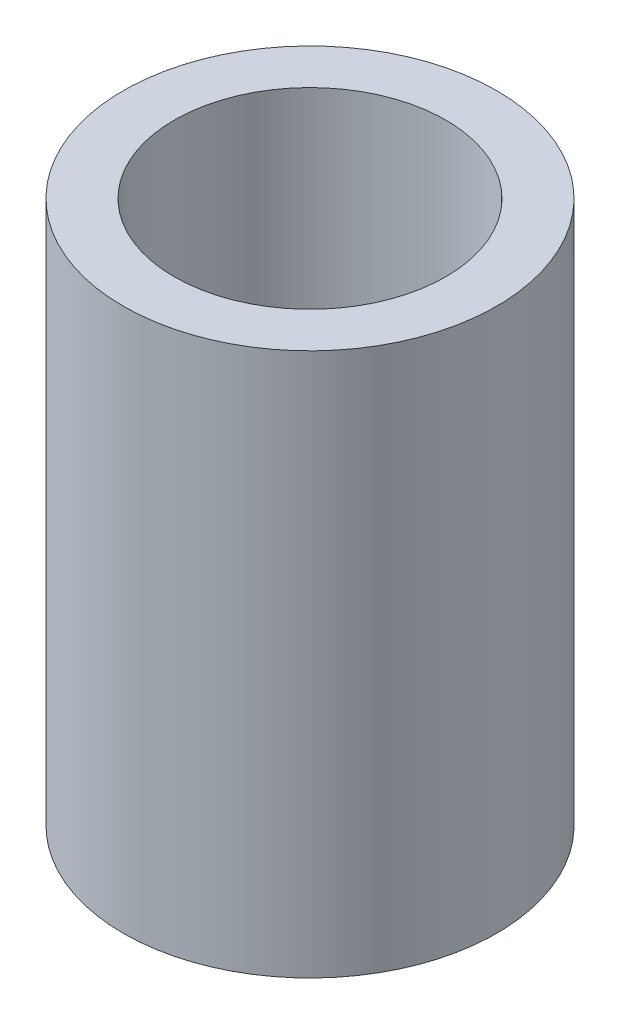
ISO-10303-21;
HEADER;
FILE_DESCRIPTION(('STEP AP214'),'2;1');
FILE_NAME('part.step','',(''),(''),'','','');
FILE_SCHEMA(('AUTOMOTIVE_DESIGN { 1 0 10303 214 1 1 1 1 }'));
ENDSEC;
DATA;
#1=APPLICATION_CONTEXT('core data for automotive mechanical design processes');
#2=APPLICATION_PROTOCOL_DEFINITION('international standard','automotive_design',2000,#1);
#3=PRODUCT_CONTEXT('',#1,'mechanical');
#4=PRODUCT('Part','Part','',(#3));
#5=PRODUCT_RELATED_PRODUCT_CATEGORY('part','',(#4));
#6=PRODUCT_DEFINITION_FORMATION('','',#4);
#7=PRODUCT_DEFINITION_CONTEXT('part definition',#1,'design');
#8=PRODUCT_DEFINITION('design','',#6,#7);
#9=PRODUCT_DEFINITION_SHAPE('','',#8);
#10=(LENGTH_UNIT() NAMED_UNIT(*) SI_UNIT(.MILLI.,.METRE.));
#11=(NAMED_UNIT(*) PLANE_ANGLE_UNIT() SI_UNIT($,.RADIAN.));
#12=(NAMED_UNIT(*) SI_UNIT($,.STERADIAN.) SOLID_ANGLE_UNIT());
#13=UNCERTAINTY_MEASURE_WITH_UNIT(LENGTH_MEASURE(1.E-05),#10,'distance_accuracy_value','');
#14=(GEOMETRIC_REPRESENTATION_CONTEXT(3) GLOBAL_UNCERTAINTY_ASSIGNED_CONTEXT((#13)) GLOBAL_UNIT_ASSIGNED_CONTEXT((#10,
#11,#12)) REPRESENTATION_CONTEXT('',''));
#15=CARTESIAN_POINT('',(0.,0.,0.));
#16=DIRECTION('',(0.,0.,1.));
#17=DIRECTION('',(1.,0.,0.));
#18=AXIS2_PLACEMENT_3D('',#15,#16,#17);
#19=CARTESIAN_POINT('',(0.,16.,0.));
#20=DIRECTION('',(0.,-1.,0.));
#21=DIRECTION('',(0.,0.,-1.));
#22=AXIS2_PLACEMENT_3D('',#19,#20,#21);
#23=CYLINDRICAL_SURFACE('',#22,5.5);
#24=CARTESIAN_POINT('',(0.,16.,0.));
#25=DIRECTION('',(0.,1.,0.));
#26=DIRECTION('',(0.,0.,1.));
#27=AXIS2_PLACEMENT_3D('',#24,#25,#26);
#28=CIRCLE('',#27,5.5);
#29=CARTESIAN_POINT('',(0.,16.,5.5));
#30=VERTEX_POINT('',#29);
#31=EDGE_CURVE('E10',#30,#30,#28,.T.);
#32=ORIENTED_EDGE('',*,*,#31,.F.);
#33=EDGE_LOOP('',(#32));
#34=FACE_BOUND('',#33,.T.);
#35=CARTESIAN_POINT('',(0.,0.,0.));
#36=DIRECTION('',(0.,1.,0.));
#37=DIRECTION('',(0.,0.,1.));
#38=AXIS2_PLACEMENT_3D('',#35,#36,#37);
#39=CIRCLE('',#38,5.5);
#40=CARTESIAN_POINT('',(0.,0.,5.5));
#41=VERTEX_POINT('',#40);
#42=EDGE_CURVE('E37',#41,#41,#39,.T.);
#43=ORIENTED_EDGE('',*,*,#42,.T.);
#44=EDGE_LOOP('',(#43));
#45=FACE_BOUND('',#44,.T.);
#46=ADVANCED_FACE('F34',(#34,#45),#23,.T.);
#47=CARTESIAN_POINT('',(0.,16.,0.));
#48=DIRECTION('',(0.,1.,0.));
#49=DIRECTION('',(0.,0.,1.));
#50=AXIS2_PLACEMENT_3D('',#47,#48,#49);
#51=PLANE('',#50);
#52=CARTESIAN_POINT('',(0.,16.,0.));
#53=DIRECTION('',(0.,1.,0.));
#54=DIRECTION('',(0.,0.,1.));
#55=AXIS2_PLACEMENT_3D('',#52,#53,#54);
#56=CIRCLE('',#55,4.);
#57=CARTESIAN_POINT('',(0.,16.,4.));
#58=VERTEX_POINT('',#57);
#59=EDGE_CURVE('E48',#58,#58,#56,.T.);
#60=ORIENTED_EDGE('',*,*,#59,.F.);
#61=EDGE_LOOP('',(#60));
#62=FACE_BOUND('',#61,.T.);
#63=ORIENTED_EDGE('',*,*,#31,.T.);
#64=EDGE_LOOP('',(#63));
#65=FACE_BOUND('',#64,.T.);
#66=ADVANCED_FACE('F55',(#62,#65),#51,.T.);
#67=CARTESIAN_POINT('',(0.,0.,0.));
#68=DIRECTION('',(0.,1.,0.));
#69=DIRECTION('',(0.,0.,1.));
#70=AXIS2_PLACEMENT_3D('',#67,#68,#69);
#71=PLANE('',#70);
#72=CARTESIAN_POINT('',(0.,0.,0.));
#73=DIRECTION('',(0.,1.,0.));
#74=DIRECTION('',(0.,0.,1.));
#75=AXIS2_PLACEMENT_3D('',#72,#73,#74);
#76=CIRCLE('',#75,4.);
#77=CARTESIAN_POINT('',(0.,0.,4.));
#78=VERTEX_POINT('',#77);
#79=EDGE_CURVE('E44',#78,#78,#76,.F.);
#80=ORIENTED_EDGE('',*,*,#79,.F.);
#81=EDGE_LOOP('',(#80));
#82=FACE_BOUND('',#81,.T.);
#83=ORIENTED_EDGE('',*,*,#42,.F.);
#84=EDGE_LOOP('',(#83));
#85=FACE_BOUND('',#84,.T.);
#86=ADVANCED_FACE('F57',(#82,#85),#71,.F.);
#87=CARTESIAN_POINT('',(0.,-0.001000000000001,0.));
#88=DIRECTION('',(0.,1.,0.));
#89=DIRECTION('',(0.,0.,1.));
#90=AXIS2_PLACEMENT_3D('',#87,#88,#89);
#91=CYLINDRICAL_SURFACE('',#90,4.);
#92=ORIENTED_EDGE('',*,*,#59,.T.);
#93=EDGE_LOOP('',(#92));
#94=FACE_BOUND('',#93,.T.);
#95=ORIENTED_EDGE('',*,*,#79,.T.);
#96=EDGE_LOOP('',(#95));
#97=FACE_BOUND('',#96,.T.);
#98=ADVANCED_FACE('F52',(#94,#97),#91,.F.);
#99=CLOSED_SHELL('',(#46,#66,#86,#98));
#100=MANIFOLD_SOLID_BREP('B2',#99);
#101=ADVANCED_BREP_SHAPE_REPRESENTATION('',(#18,#100),#14);
#102=SHAPE_DEFINITION_REPRESENTATION(#9,#101);
ENDSEC;
END-ISO-10303-21;
